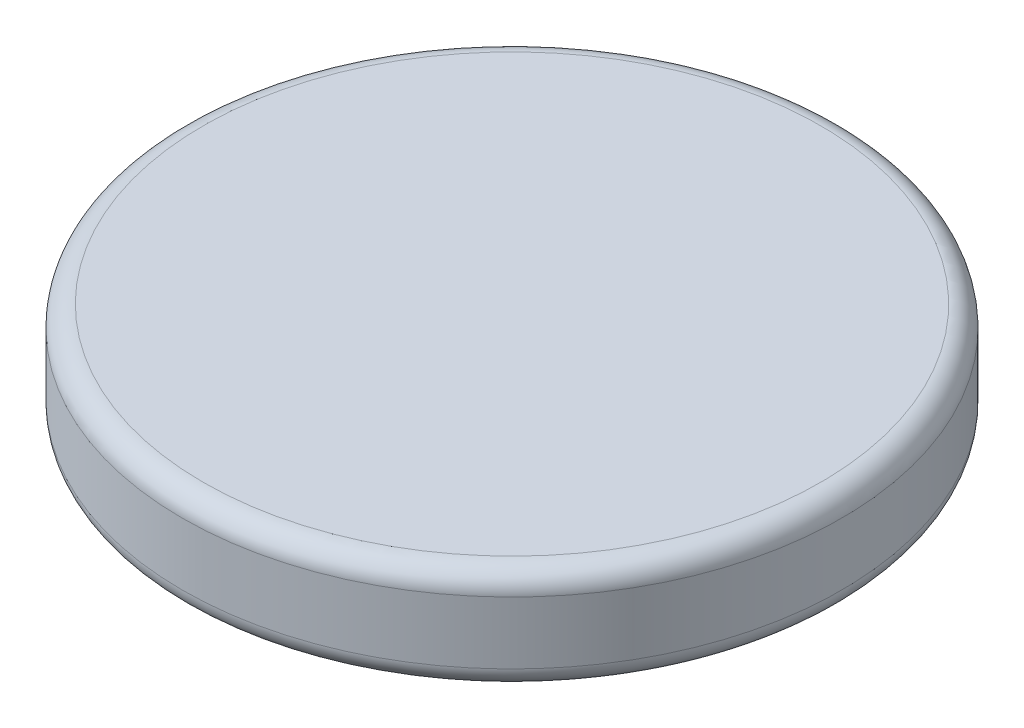
ISO-10303-21;
HEADER;
FILE_DESCRIPTION(('STEP AP214'),'2;1');
FILE_NAME('part.step','',(''),(''),'','','');
FILE_SCHEMA(('AUTOMOTIVE_DESIGN { 1 0 10303 214 1 1 1 1 }'));
ENDSEC;
DATA;
#1=APPLICATION_CONTEXT('core data for automotive mechanical design processes');
#2=APPLICATION_PROTOCOL_DEFINITION('international standard','automotive_design',2000,#1);
#3=PRODUCT_CONTEXT('',#1,'mechanical');
#4=PRODUCT('Part','Part','',(#3));
#5=PRODUCT_RELATED_PRODUCT_CATEGORY('part','',(#4));
#6=PRODUCT_DEFINITION_FORMATION('','',#4);
#7=PRODUCT_DEFINITION_CONTEXT('part definition',#1,'design');
#8=PRODUCT_DEFINITION('design','',#6,#7);
#9=PRODUCT_DEFINITION_SHAPE('','',#8);
#10=(LENGTH_UNIT() NAMED_UNIT(*) SI_UNIT(.MILLI.,.METRE.));
#11=(NAMED_UNIT(*) PLANE_ANGLE_UNIT() SI_UNIT($,.RADIAN.));
#12=(NAMED_UNIT(*) SI_UNIT($,.STERADIAN.) SOLID_ANGLE_UNIT());
#13=UNCERTAINTY_MEASURE_WITH_UNIT(LENGTH_MEASURE(1.E-05),#10,'distance_accuracy_value','');
#14=(GEOMETRIC_REPRESENTATION_CONTEXT(3) GLOBAL_UNCERTAINTY_ASSIGNED_CONTEXT((#13)) GLOBAL_UNIT_ASSIGNED_CONTEXT((#10,
#11,#12)) REPRESENTATION_CONTEXT('',''));
#15=CARTESIAN_POINT('',(0.,0.,0.));
#16=DIRECTION('',(0.,0.,1.));
#17=DIRECTION('',(1.,0.,0.));
#18=AXIS2_PLACEMENT_3D('',#15,#16,#17);
#19=CARTESIAN_POINT('',(0.,100.,0.));
#20=DIRECTION('',(0.,-1.,0.));
#21=DIRECTION('',(0.,0.,-1.));
#22=AXIS2_PLACEMENT_3D('',#19,#20,#21);
#23=CYLINDRICAL_SURFACE('',#22,317.5);
#24=CARTESIAN_POINT('',(0.,20.,0.));
#25=DIRECTION('',(0.,1.,0.));
#26=DIRECTION('',(0.,0.,1.));
#27=AXIS2_PLACEMENT_3D('',#24,#25,#26);
#28=CIRCLE('',#27,317.5);
#29=CARTESIAN_POINT('',(0.,20.,317.5));
#30=VERTEX_POINT('',#29);
#31=EDGE_CURVE('E47',#30,#30,#28,.T.);
#32=ORIENTED_EDGE('',*,*,#31,.T.);
#33=EDGE_LOOP('',(#32));
#34=FACE_BOUND('',#33,.T.);
#35=CARTESIAN_POINT('',(0.,80.,0.));
#36=DIRECTION('',(0.,1.,0.));
#37=DIRECTION('',(0.,0.,1.));
#38=AXIS2_PLACEMENT_3D('',#35,#36,#37);
#39=CIRCLE('',#38,317.5);
#40=CARTESIAN_POINT('',(0.,80.,317.5));
#41=VERTEX_POINT('',#40);
#42=EDGE_CURVE('E52',#41,#41,#39,.F.);
#43=ORIENTED_EDGE('',*,*,#42,.T.);
#44=EDGE_LOOP('',(#43));
#45=FACE_BOUND('',#44,.T.);
#46=ADVANCED_FACE('F32',(#34,#45),#23,.T.);
#47=CARTESIAN_POINT('',(0.,100.,0.));
#48=DIRECTION('',(0.,1.,0.));
#49=DIRECTION('',(0.,0.,1.));
#50=AXIS2_PLACEMENT_3D('',#47,#48,#49);
#51=PLANE('',#50);
#52=CARTESIAN_POINT('',(0.,100.,0.));
#53=DIRECTION('',(0.,1.,0.));
#54=DIRECTION('',(0.,0.,1.));
#55=AXIS2_PLACEMENT_3D('',#52,#53,#54);
#56=CIRCLE('',#55,297.5);
#57=CARTESIAN_POINT('',(0.,100.,297.5));
#58=VERTEX_POINT('',#57);
#59=EDGE_CURVE('E39',#58,#58,#56,.T.);
#60=ORIENTED_EDGE('',*,*,#59,.T.);
#61=EDGE_LOOP('',(#60));
#62=FACE_BOUND('',#61,.T.);
#63=ADVANCED_FACE('F83',(#62),#51,.T.);
#64=CARTESIAN_POINT('',(0.,0.,0.));
#65=DIRECTION('',(0.,1.,0.));
#66=DIRECTION('',(0.,0.,1.));
#67=AXIS2_PLACEMENT_3D('',#64,#65,#66);
#68=PLANE('',#67);
#69=CARTESIAN_POINT('',(0.,0.,0.));
#70=DIRECTION('',(0.,1.,0.));
#71=DIRECTION('',(0.,0.,1.));
#72=AXIS2_PLACEMENT_3D('',#69,#70,#71);
#73=CIRCLE('',#72,63.5);
#74=CARTESIAN_POINT('',(0.,0.,63.5));
#75=VERTEX_POINT('',#74);
#76=EDGE_CURVE('E56',#75,#75,#73,.T.);
#77=ORIENTED_EDGE('',*,*,#76,.T.);
#78=EDGE_LOOP('',(#77));
#79=FACE_BOUND('',#78,.T.);
#80=CARTESIAN_POINT('',(0.,0.,0.));
#81=DIRECTION('',(0.,1.,0.));
#82=DIRECTION('',(0.,0.,1.));
#83=AXIS2_PLACEMENT_3D('',#80,#81,#82);
#84=CIRCLE('',#83,297.5);
#85=CARTESIAN_POINT('',(0.,0.,297.5));
#86=VERTEX_POINT('',#85);
#87=EDGE_CURVE('E43',#86,#86,#84,.F.);
#88=ORIENTED_EDGE('',*,*,#87,.T.);
#89=EDGE_LOOP('',(#88));
#90=FACE_BOUND('',#89,.T.);
#91=ADVANCED_FACE('F79',(#79,#90),#68,.F.);
#92=CARTESIAN_POINT('',(0.,20.,0.));
#93=DIRECTION('',(0.,1.,0.));
#94=DIRECTION('',(0.,0.,1.));
#95=AXIS2_PLACEMENT_3D('',#92,#93,#94);
#96=TOROIDAL_SURFACE('',#95,297.5,20.);
#97=ORIENTED_EDGE('',*,*,#87,.F.);
#98=EDGE_LOOP('',(#97));
#99=FACE_BOUND('',#98,.T.);
#100=ORIENTED_EDGE('',*,*,#31,.F.);
#101=EDGE_LOOP('',(#100));
#102=FACE_BOUND('',#101,.T.);
#103=ADVANCED_FACE('F92',(#99,#102),#96,.T.);
#104=CARTESIAN_POINT('',(0.,80.,0.));
#105=DIRECTION('',(0.,1.,0.));
#106=DIRECTION('',(0.,0.,1.));
#107=AXIS2_PLACEMENT_3D('',#104,#105,#106);
#108=TOROIDAL_SURFACE('',#107,297.5,20.);
#109=ORIENTED_EDGE('',*,*,#42,.F.);
#110=EDGE_LOOP('',(#109));
#111=FACE_BOUND('',#110,.T.);
#112=ORIENTED_EDGE('',*,*,#59,.F.);
#113=EDGE_LOOP('',(#112));
#114=FACE_BOUND('',#113,.T.);
#115=ADVANCED_FACE('F34',(#111,#114),#108,.T.);
#116=CARTESIAN_POINT('',(0.,-9.99999999999995,0.));
#117=DIRECTION('',(0.,1.,0.));
#118=DIRECTION('',(0.,0.,1.));
#119=AXIS2_PLACEMENT_3D('',#116,#117,#118);
#120=CYLINDRICAL_SURFACE('',#119,63.5);
#121=CARTESIAN_POINT('',(0.,-9.99999999999995,0.));
#122=DIRECTION('',(0.,1.,0.));
#123=DIRECTION('',(0.,0.,1.));
#124=AXIS2_PLACEMENT_3D('',#121,#122,#123);
#125=CIRCLE('',#124,63.5);
#126=CARTESIAN_POINT('',(0.,-9.99999999999995,63.5));
#127=VERTEX_POINT('',#126);
#128=EDGE_CURVE('E55',#127,#127,#125,.T.);
#129=ORIENTED_EDGE('',*,*,#128,.T.);
#130=EDGE_LOOP('',(#129));
#131=FACE_BOUND('',#130,.T.);
#132=ORIENTED_EDGE('',*,*,#76,.F.);
#133=EDGE_LOOP('',(#132));
#134=FACE_BOUND('',#133,.T.);
#135=ADVANCED_FACE('F80',(#131,#134),#120,.T.);
#136=CARTESIAN_POINT('',(0.,-9.99999999999995,0.));
#137=DIRECTION('',(0.,1.,0.));
#138=DIRECTION('',(0.,0.,1.));
#139=AXIS2_PLACEMENT_3D('',#136,#137,#138);
#140=PLANE('',#139);
#141=CARTESIAN_POINT('',(0.,-9.99999999999995,0.));
#142=DIRECTION('',(0.,1.,0.));
#143=DIRECTION('',(0.,0.,1.));
#144=AXIS2_PLACEMENT_3D('',#141,#142,#143);
#145=CIRCLE('',#144,50.8);
#146=CARTESIAN_POINT('',(0.,-9.99999999999995,50.8));
#147=VERTEX_POINT('',#146);
#148=EDGE_CURVE('E59',#147,#147,#145,.T.);
#149=ORIENTED_EDGE('',*,*,#148,.T.);
#150=EDGE_LOOP('',(#149));
#151=FACE_BOUND('',#150,.T.);
#152=ORIENTED_EDGE('',*,*,#128,.F.);
#153=EDGE_LOOP('',(#152));
#154=FACE_BOUND('',#153,.T.);
#155=ADVANCED_FACE('F65',(#151,#154),#140,.F.);
#156=CARTESIAN_POINT('',(0.,-9.99999999999995,0.));
#157=DIRECTION('',(0.,1.,0.));
#158=DIRECTION('',(0.,0.,1.));
#159=AXIS2_PLACEMENT_3D('',#156,#157,#158);
#160=CYLINDRICAL_SURFACE('',#159,50.8);
#161=ORIENTED_EDGE('',*,*,#148,.F.);
#162=EDGE_LOOP('',(#161));
#163=FACE_BOUND('',#162,.T.);
#164=CARTESIAN_POINT('',(0.,0.,0.));
#165=DIRECTION('',(0.,1.,0.));
#166=DIRECTION('',(0.,0.,1.));
#167=AXIS2_PLACEMENT_3D('',#164,#165,#166);
#168=CIRCLE('',#167,50.8);
#169=CARTESIAN_POINT('',(0.,0.,50.8));
#170=VERTEX_POINT('',#169);
#171=EDGE_CURVE('E10',#170,#170,#168,.T.);
#172=ORIENTED_EDGE('',*,*,#171,.T.);
#173=EDGE_LOOP('',(#172));
#174=FACE_BOUND('',#173,.T.);
#175=ADVANCED_FACE('F68',(#163,#174),#160,.F.);
#176=ORIENTED_EDGE('',*,*,#171,.F.);
#177=EDGE_LOOP('',(#176));
#178=FACE_BOUND('',#177,.T.);
#179=ADVANCED_FACE('F70',(#178),#68,.F.);
#180=CLOSED_SHELL('',(#46,#63,#91,#103,#115,#135,#155,#175,#179));
#181=MANIFOLD_SOLID_BREP('B2',#180);
#182=ADVANCED_BREP_SHAPE_REPRESENTATION('',(#18,#181),#14);
#183=SHAPE_DEFINITION_REPRESENTATION(#9,#182);
ENDSEC;
END-ISO-10303-21;
